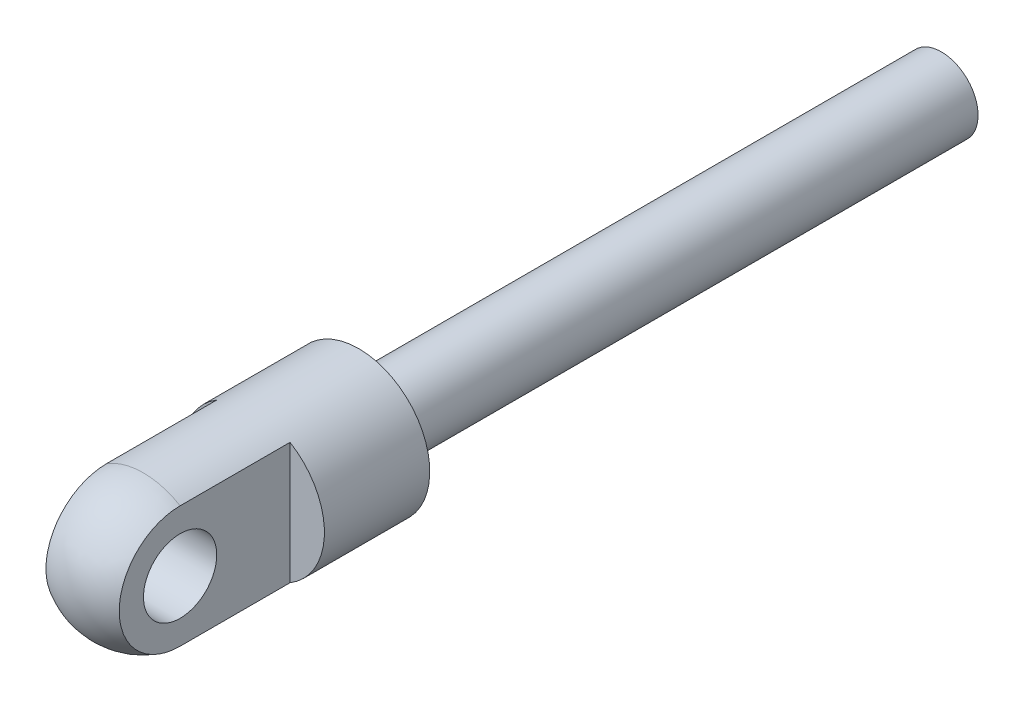
ISO-10303-21;
HEADER;
FILE_DESCRIPTION(('STEP AP214'),'2;1');
FILE_NAME('part.step','',(''),(''),'','','');
FILE_SCHEMA(('AUTOMOTIVE_DESIGN { 1 0 10303 214 1 1 1 1 }'));
ENDSEC;
DATA;
#1=APPLICATION_CONTEXT('core data for automotive mechanical design processes');
#2=APPLICATION_PROTOCOL_DEFINITION('international standard','automotive_design',2000,#1);
#3=PRODUCT_CONTEXT('',#1,'mechanical');
#4=PRODUCT('Part','Part','',(#3));
#5=PRODUCT_RELATED_PRODUCT_CATEGORY('part','',(#4));
#6=PRODUCT_DEFINITION_FORMATION('','',#4);
#7=PRODUCT_DEFINITION_CONTEXT('part definition',#1,'design');
#8=PRODUCT_DEFINITION('design','',#6,#7);
#9=PRODUCT_DEFINITION_SHAPE('','',#8);
#10=(LENGTH_UNIT() NAMED_UNIT(*) SI_UNIT(.MILLI.,.METRE.));
#11=(NAMED_UNIT(*) PLANE_ANGLE_UNIT() SI_UNIT($,.RADIAN.));
#12=(NAMED_UNIT(*) SI_UNIT($,.STERADIAN.) SOLID_ANGLE_UNIT());
#13=UNCERTAINTY_MEASURE_WITH_UNIT(LENGTH_MEASURE(1.E-05),#10,'distance_accuracy_value','');
#14=(GEOMETRIC_REPRESENTATION_CONTEXT(3) GLOBAL_UNCERTAINTY_ASSIGNED_CONTEXT((#13)) GLOBAL_UNIT_ASSIGNED_CONTEXT((#10,
#11,#12)) REPRESENTATION_CONTEXT('',''));
#15=CARTESIAN_POINT('',(0.,0.,0.));
#16=DIRECTION('',(0.,0.,1.));
#17=DIRECTION('',(1.,0.,0.));
#18=AXIS2_PLACEMENT_3D('',#15,#16,#17);
#19=CARTESIAN_POINT('',(0.,0.,28.956));
#20=DIRECTION('',(0.,0.,-1.));
#21=DIRECTION('',(0.,1.,0.));
#22=AXIS2_PLACEMENT_3D('',#19,#20,#21);
#23=CYLINDRICAL_SURFACE('',#22,3.937);
#24=CARTESIAN_POINT('',(0.,0.,25.019));
#25=DIRECTION('',(0.,0.,-1.));
#26=DIRECTION('',(0.,1.,0.));
#27=AXIS2_PLACEMENT_3D('',#24,#25,#26);
#28=CIRCLE('',#27,3.937);
#29=CARTESIAN_POINT('',(-2.032,3.37208318402734,25.019));
#30=VERTEX_POINT('',#29);
#31=CARTESIAN_POINT('',(2.032,3.37208318402734,25.019));
#32=VERTEX_POINT('',#31);
#33=EDGE_CURVE('E55',#30,#32,#28,.T.);
#34=ORIENTED_EDGE('',*,*,#33,.T.);
#35=DIRECTION('',(0.,0.,-1.));
#36=VECTOR('',#35,1.);
#37=CARTESIAN_POINT('',(2.032,3.37208318402734,28.956));
#38=LINE('',#37,#36);
#39=CARTESIAN_POINT('',(2.032,3.37208318402735,18.923));
#40=VERTEX_POINT('',#39);
#41=EDGE_CURVE('E85',#32,#40,#38,.T.);
#42=ORIENTED_EDGE('',*,*,#41,.T.);
#43=CARTESIAN_POINT('',(0.,0.,18.923));
#44=DIRECTION('',(0.,0.,1.));
#45=DIRECTION('',(1.,0.,0.));
#46=AXIS2_PLACEMENT_3D('',#43,#44,#45);
#47=CIRCLE('',#46,3.937);
#48=CARTESIAN_POINT('',(2.032,-3.37208318402734,18.923));
#49=VERTEX_POINT('',#48);
#50=EDGE_CURVE('E37',#40,#49,#47,.F.);
#51=ORIENTED_EDGE('',*,*,#50,.T.);
#52=DIRECTION('',(0.,0.,-1.));
#53=VECTOR('',#52,1.);
#54=CARTESIAN_POINT('',(2.032,-3.37208318402734,28.956));
#55=LINE('',#54,#53);
#56=CARTESIAN_POINT('',(2.032,-3.37208318402734,25.019));
#57=VERTEX_POINT('',#56);
#58=EDGE_CURVE('E76',#49,#57,#55,.F.);
#59=ORIENTED_EDGE('',*,*,#58,.T.);
#60=CARTESIAN_POINT('',(-2.032,-3.37208318402734,25.019));
#61=VERTEX_POINT('',#60);
#62=EDGE_CURVE('E48',#57,#61,#28,.T.);
#63=ORIENTED_EDGE('',*,*,#62,.T.);
#64=DIRECTION('',(0.,0.,-1.));
#65=VECTOR('',#64,1.);
#66=CARTESIAN_POINT('',(-2.032,-3.37208318402735,28.956));
#67=LINE('',#66,#65);
#68=CARTESIAN_POINT('',(-2.032,-3.37208318402734,18.923));
#69=VERTEX_POINT('',#68);
#70=EDGE_CURVE('E110',#61,#69,#67,.T.);
#71=ORIENTED_EDGE('',*,*,#70,.T.);
#72=CARTESIAN_POINT('',(-2.032,3.37208318402735,18.923));
#73=VERTEX_POINT('',#72);
#74=EDGE_CURVE('E11',#69,#73,#47,.F.);
#75=ORIENTED_EDGE('',*,*,#74,.T.);
#76=DIRECTION('',(0.,0.,-1.));
#77=VECTOR('',#76,1.);
#78=CARTESIAN_POINT('',(-2.032,3.37208318402735,28.956));
#79=LINE('',#78,#77);
#80=EDGE_CURVE('E113',#73,#30,#79,.F.);
#81=ORIENTED_EDGE('',*,*,#80,.T.);
#82=EDGE_LOOP('',(#34,#42,#51,#59,#63,#71,#75,#81));
#83=FACE_BOUND('',#82,.T.);
#84=CARTESIAN_POINT('',(0.,0.,13.081));
#85=DIRECTION('',(0.,0.,-1.));
#86=DIRECTION('',(0.,1.,0.));
#87=AXIS2_PLACEMENT_3D('',#84,#85,#86);
#88=CIRCLE('',#87,3.937);
#89=CARTESIAN_POINT('',(0.,3.937,13.081));
#90=VERTEX_POINT('',#89);
#91=EDGE_CURVE('E100',#90,#90,#88,.T.);
#92=ORIENTED_EDGE('',*,*,#91,.F.);
#93=EDGE_LOOP('',(#92));
#94=FACE_BOUND('',#93,.T.);
#95=ADVANCED_FACE('F33',(#83,#94),#23,.T.);
#96=CARTESIAN_POINT('',(0.,0.,25.019));
#97=DIRECTION('',(0.,0.,-1.));
#98=DIRECTION('',(0.,1.,0.));
#99=AXIS2_PLACEMENT_3D('',#96,#97,#98);
#100=SPHERICAL_SURFACE('',#99,3.937);
#101=ORIENTED_EDGE('',*,*,#33,.F.);
#102=CARTESIAN_POINT('',(-2.032,0.,25.019));
#103=DIRECTION('',(-1.,0.,0.));
#104=DIRECTION('',(0.,0.,1.));
#105=AXIS2_PLACEMENT_3D('',#102,#103,#104);
#106=CIRCLE('',#105,3.37208318402734);
#107=EDGE_CURVE('E106',#30,#61,#106,.F.);
#108=ORIENTED_EDGE('',*,*,#107,.T.);
#109=ORIENTED_EDGE('',*,*,#62,.F.);
#110=CARTESIAN_POINT('',(2.032,0.,25.019));
#111=DIRECTION('',(1.,0.,0.));
#112=DIRECTION('',(0.,1.,0.));
#113=AXIS2_PLACEMENT_3D('',#110,#111,#112);
#114=CIRCLE('',#113,3.37208318402734);
#115=EDGE_CURVE('E82',#57,#32,#114,.F.);
#116=ORIENTED_EDGE('',*,*,#115,.T.);
#117=EDGE_LOOP('',(#101,#108,#109,#116));
#118=FACE_BOUND('',#117,.T.);
#119=ADVANCED_FACE('F123',(#118),#100,.T.);
#120=CARTESIAN_POINT('',(0.,2.032,-19.2278));
#121=DIRECTION('',(0.,0.,-1.));
#122=DIRECTION('',(-1.,0.,0.));
#123=AXIS2_PLACEMENT_3D('',#120,#121,#122);
#124=PLANE('',#123);
#125=CARTESIAN_POINT('',(0.,0.,-19.2278));
#126=DIRECTION('',(0.,0.,-1.));
#127=DIRECTION('',(-1.,0.,0.));
#128=AXIS2_PLACEMENT_3D('',#125,#126,#127);
#129=CIRCLE('',#128,2.032);
#130=CARTESIAN_POINT('',(-2.032,0.,-19.2278));
#131=VERTEX_POINT('',#130);
#132=EDGE_CURVE('E93',#131,#131,#129,.T.);
#133=ORIENTED_EDGE('',*,*,#132,.T.);
#134=EDGE_LOOP('',(#133));
#135=FACE_BOUND('',#134,.T.);
#136=ADVANCED_FACE('F35',(#135),#124,.T.);
#137=CARTESIAN_POINT('',(0.,0.,13.081));
#138=DIRECTION('',(0.,0.,-1.));
#139=DIRECTION('',(-1.,0.,0.));
#140=AXIS2_PLACEMENT_3D('',#137,#138,#139);
#141=CYLINDRICAL_SURFACE('',#140,2.032);
#142=CARTESIAN_POINT('',(0.,0.,13.081));
#143=DIRECTION('',(0.,0.,-1.));
#144=DIRECTION('',(0.,1.,0.));
#145=AXIS2_PLACEMENT_3D('',#142,#143,#144);
#146=CIRCLE('',#145,2.032);
#147=CARTESIAN_POINT('',(0.,2.032,13.081));
#148=VERTEX_POINT('',#147);
#149=EDGE_CURVE('E95',#148,#148,#146,.F.);
#150=ORIENTED_EDGE('',*,*,#149,.F.);
#151=EDGE_LOOP('',(#150));
#152=FACE_BOUND('',#151,.T.);
#153=ORIENTED_EDGE('',*,*,#132,.F.);
#154=EDGE_LOOP('',(#153));
#155=FACE_BOUND('',#154,.T.);
#156=ADVANCED_FACE('F132',(#152,#155),#141,.T.);
#157=CARTESIAN_POINT('',(0.,0.,13.081));
#158=DIRECTION('',(0.,0.,-1.));
#159=DIRECTION('',(0.,1.,0.));
#160=AXIS2_PLACEMENT_3D('',#157,#158,#159);
#161=PLANE('',#160);
#162=ORIENTED_EDGE('',*,*,#149,.T.);
#163=EDGE_LOOP('',(#162));
#164=FACE_BOUND('',#163,.T.);
#165=ORIENTED_EDGE('',*,*,#91,.T.);
#166=EDGE_LOOP('',(#165));
#167=FACE_BOUND('',#166,.T.);
#168=ADVANCED_FACE('F121',(#164,#167),#161,.T.);
#169=CARTESIAN_POINT('',(2.032,3.937,18.923));
#170=DIRECTION('',(1.,0.,0.));
#171=DIRECTION('',(0.,1.,0.));
#172=AXIS2_PLACEMENT_3D('',#169,#170,#171);
#173=PLANE('',#172);
#174=DIRECTION('',(0.,1.,0.));
#175=VECTOR('',#174,1.);
#176=CARTESIAN_POINT('',(2.032,3.937,18.923));
#177=LINE('',#176,#175);
#178=EDGE_CURVE('E80',#49,#40,#177,.T.);
#179=ORIENTED_EDGE('',*,*,#178,.T.);
#180=ORIENTED_EDGE('',*,*,#41,.F.);
#181=ORIENTED_EDGE('',*,*,#115,.F.);
#182=ORIENTED_EDGE('',*,*,#58,.F.);
#183=EDGE_LOOP('',(#179,#180,#181,#182));
#184=FACE_BOUND('',#183,.T.);
#185=CARTESIAN_POINT('',(2.032,0.,25.019));
#186=DIRECTION('',(1.,0.,0.));
#187=DIRECTION('',(0.,1.,0.));
#188=AXIS2_PLACEMENT_3D('',#185,#186,#187);
#189=CIRCLE('',#188,2.03200000000001);
#190=CARTESIAN_POINT('',(2.032,0.,22.987));
#191=VERTEX_POINT('',#190);
#192=EDGE_CURVE('E89',#191,#191,#189,.F.);
#193=ORIENTED_EDGE('',*,*,#192,.T.);
#194=EDGE_LOOP('',(#193));
#195=FACE_BOUND('',#194,.T.);
#196=ADVANCED_FACE('F78',(#184,#195),#173,.T.);
#197=CARTESIAN_POINT('',(0.,0.,18.923));
#198=DIRECTION('',(0.,0.,1.));
#199=DIRECTION('',(1.,0.,0.));
#200=AXIS2_PLACEMENT_3D('',#197,#198,#199);
#201=PLANE('',#200);
#202=ORIENTED_EDGE('',*,*,#178,.F.);
#203=ORIENTED_EDGE('',*,*,#50,.F.);
#204=EDGE_LOOP('',(#202,#203));
#205=FACE_BOUND('',#204,.T.);
#206=ADVANCED_FACE('F88',(#205),#201,.T.);
#207=DIRECTION('',(0.,-1.,0.));
#208=VECTOR('',#207,1.);
#209=CARTESIAN_POINT('',(-2.032,3.937,18.923));
#210=LINE('',#209,#208);
#211=EDGE_CURVE('E90',#73,#69,#210,.T.);
#212=ORIENTED_EDGE('',*,*,#211,.F.);
#213=ORIENTED_EDGE('',*,*,#74,.F.);
#214=EDGE_LOOP('',(#212,#213));
#215=FACE_BOUND('',#214,.T.);
#216=ADVANCED_FACE('F178',(#215),#201,.T.);
#217=CARTESIAN_POINT('',(-2.032,3.937,18.923));
#218=DIRECTION('',(-1.,0.,0.));
#219=DIRECTION('',(0.,0.,1.));
#220=AXIS2_PLACEMENT_3D('',#217,#218,#219);
#221=PLANE('',#220);
#222=ORIENTED_EDGE('',*,*,#211,.T.);
#223=ORIENTED_EDGE('',*,*,#70,.F.);
#224=ORIENTED_EDGE('',*,*,#107,.F.);
#225=ORIENTED_EDGE('',*,*,#80,.F.);
#226=EDGE_LOOP('',(#222,#223,#224,#225));
#227=FACE_BOUND('',#226,.T.);
#228=CARTESIAN_POINT('',(-2.032,0.,25.019));
#229=DIRECTION('',(-1.,0.,0.));
#230=DIRECTION('',(0.,0.,1.));
#231=AXIS2_PLACEMENT_3D('',#228,#229,#230);
#232=CIRCLE('',#231,2.03200000000001);
#233=CARTESIAN_POINT('',(-2.032,0.,22.987));
#234=VERTEX_POINT('',#233);
#235=EDGE_CURVE('E84',#234,#234,#232,.F.);
#236=ORIENTED_EDGE('',*,*,#235,.T.);
#237=EDGE_LOOP('',(#236));
#238=FACE_BOUND('',#237,.T.);
#239=ADVANCED_FACE('F186',(#227,#238),#221,.T.);
#240=CARTESIAN_POINT('',(-5.969,0.,25.019));
#241=DIRECTION('',(1.,0.,0.));
#242=DIRECTION('',(0.,0.,-1.));
#243=AXIS2_PLACEMENT_3D('',#240,#241,#242);
#244=CYLINDRICAL_SURFACE('',#243,2.03200000000001);
#245=CARTESIAN_POINT('',(2.032,0.,22.987));
#246=CARTESIAN_POINT('',(1.98966666666666,0.,22.987));
#247=CARTESIAN_POINT('',(1.94733333333333,0.,22.987));
#248=CARTESIAN_POINT('',(1.86266666666666,0.,22.987));
#249=CARTESIAN_POINT('',(1.82033333333333,0.,22.987));
#250=CARTESIAN_POINT('',(1.73566666666667,0.,22.987));
#251=CARTESIAN_POINT('',(1.69333333333333,0.,22.987));
#252=CARTESIAN_POINT('',(1.60866666666667,0.,22.987));
#253=CARTESIAN_POINT('',(1.56633333333333,0.,22.987));
#254=CARTESIAN_POINT('',(1.48166666666666,0.,22.987));
#255=CARTESIAN_POINT('',(1.43933333333333,0.,22.987));
#256=CARTESIAN_POINT('',(1.35466666666666,0.,22.987));
#257=CARTESIAN_POINT('',(1.31233333333333,0.,22.987));
#258=CARTESIAN_POINT('',(1.22766666666667,0.,22.987));
#259=CARTESIAN_POINT('',(1.18533333333333,0.,22.987));
#260=CARTESIAN_POINT('',(1.10066666666667,0.,22.987));
#261=CARTESIAN_POINT('',(1.05833333333333,0.,22.987));
#262=CARTESIAN_POINT('',(0.973666666666665,0.,22.987));
#263=CARTESIAN_POINT('',(0.931333333333332,0.,22.987));
#264=CARTESIAN_POINT('',(0.846666666666665,0.,22.987));
#265=CARTESIAN_POINT('',(0.804333333333332,0.,22.987));
#266=CARTESIAN_POINT('',(0.719666666666666,0.,22.987));
#267=CARTESIAN_POINT('',(0.677333333333332,0.,22.987));
#268=CARTESIAN_POINT('',(0.592666666666666,0.,22.987));
#269=CARTESIAN_POINT('',(0.550333333333332,0.,22.987));
#270=CARTESIAN_POINT('',(0.465666666666665,0.,22.987));
#271=CARTESIAN_POINT('',(0.423333333333332,0.,22.987));
#272=CARTESIAN_POINT('',(0.338666666666665,0.,22.987));
#273=CARTESIAN_POINT('',(0.296333333333332,0.,22.987));
#274=CARTESIAN_POINT('',(0.211666666666666,0.,22.987));
#275=CARTESIAN_POINT('',(0.169333333333333,0.,22.987));
#276=CARTESIAN_POINT('',(0.0846666666666661,0.,22.987));
#277=CARTESIAN_POINT('',(0.0423333333333326,0.,22.987));
#278=CARTESIAN_POINT('',(-0.0423333333333343,0.,22.987));
#279=CARTESIAN_POINT('',(-0.0846666666666678,0.,22.987));
#280=CARTESIAN_POINT('',(-0.169333333333334,0.,22.987));
#281=CARTESIAN_POINT('',(-0.211666666666668,0.,22.987));
#282=CARTESIAN_POINT('',(-0.296333333333334,0.,22.987));
#283=CARTESIAN_POINT('',(-0.338666666666667,0.,22.987));
#284=CARTESIAN_POINT('',(-0.423333333333334,0.,22.987));
#285=CARTESIAN_POINT('',(-0.465666666666667,0.,22.987));
#286=CARTESIAN_POINT('',(-0.550333333333334,0.,22.987));
#287=CARTESIAN_POINT('',(-0.592666666666668,0.,22.987));
#288=CARTESIAN_POINT('',(-0.677333333333334,0.,22.987));
#289=CARTESIAN_POINT('',(-0.719666666666667,0.,22.987));
#290=CARTESIAN_POINT('',(-0.804333333333334,0.,22.987));
#291=CARTESIAN_POINT('',(-0.846666666666667,0.,22.987));
#292=CARTESIAN_POINT('',(-0.931333333333333,0.,22.987));
#293=CARTESIAN_POINT('',(-0.973666666666667,0.,22.987));
#294=CARTESIAN_POINT('',(-1.05833333333333,0.,22.987));
#295=CARTESIAN_POINT('',(-1.10066666666667,0.,22.987));
#296=CARTESIAN_POINT('',(-1.18533333333333,0.,22.987));
#297=CARTESIAN_POINT('',(-1.22766666666667,0.,22.987));
#298=CARTESIAN_POINT('',(-1.31233333333333,0.,22.987));
#299=CARTESIAN_POINT('',(-1.35466666666667,0.,22.987));
#300=CARTESIAN_POINT('',(-1.43933333333333,0.,22.987));
#301=CARTESIAN_POINT('',(-1.48166666666667,0.,22.987));
#302=CARTESIAN_POINT('',(-1.56633333333333,0.,22.987));
#303=CARTESIAN_POINT('',(-1.60866666666667,0.,22.987));
#304=CARTESIAN_POINT('',(-1.69333333333333,0.,22.987));
#305=CARTESIAN_POINT('',(-1.73566666666667,0.,22.987));
#306=CARTESIAN_POINT('',(-1.82033333333333,0.,22.987));
#307=CARTESIAN_POINT('',(-1.86266666666667,0.,22.987));
#308=CARTESIAN_POINT('',(-1.94733333333333,0.,22.987));
#309=CARTESIAN_POINT('',(-1.98966666666667,0.,22.987));
#310=CARTESIAN_POINT('',(-2.032,0.,22.987));
#311=B_SPLINE_CURVE_WITH_KNOTS('',3,(#245,#246,#247,#248,#249,#250,#251,#252,#253,#254,#255,
#256,#257,#258,#259,#260,#261,#262,#263,#264,#265,#266,#267,#268,#269,#270,#271,#272,#273,#274,
#275,#276,#277,#278,#279,#280,#281,#282,#283,#284,#285,#286,#287,#288,#289,#290,#291,#292,#293,
#294,#295,#296,#297,#298,#299,#300,#301,#302,#303,#304,#305,#306,#307,#308,#309,#310),
.UNSPECIFIED.,.F.,.F.,(4,2,2,2,2,2,2,2,2,2,2,2,2,2,2,2,2,2,2,2,2,2,2,2,2,2,2,2,2,2,2,2,4),(0.,
0.127,0.254,0.380999999999999,0.508,0.635,0.762,0.888999999999999,1.016,1.143,1.27,1.397,1.524,
1.651,1.778,1.905,2.032,2.159,2.286,2.413,2.54,2.667,2.794,2.921,3.048,3.175,3.302,3.429,3.556,
3.683,3.81,3.937,4.064),.UNSPECIFIED.);
#312=EDGE_CURVE('BSEAM194',#191,#234,#311,.T.);
#313=ORIENTED_EDGE('',*,*,#192,.F.);
#314=ORIENTED_EDGE('',*,*,#235,.F.);
#315=ORIENTED_EDGE('',*,*,#312,.T.);
#316=ORIENTED_EDGE('',*,*,#312,.F.);
#317=EDGE_LOOP('',(#313,#315,#314,#316));
#318=FACE_BOUND('',#317,.T.);
#319=ADVANCED_FACE('F194',(#318),#244,.F.);
#320=CLOSED_SHELL('',(#95,#119,#136,#156,#168,#196,#206,#216,#239,#319));
#321=MANIFOLD_SOLID_BREP('B2',#320);
#322=ADVANCED_BREP_SHAPE_REPRESENTATION('',(#18,#321),#14);
#323=SHAPE_DEFINITION_REPRESENTATION(#9,#322);
ENDSEC;
END-ISO-10303-21;
